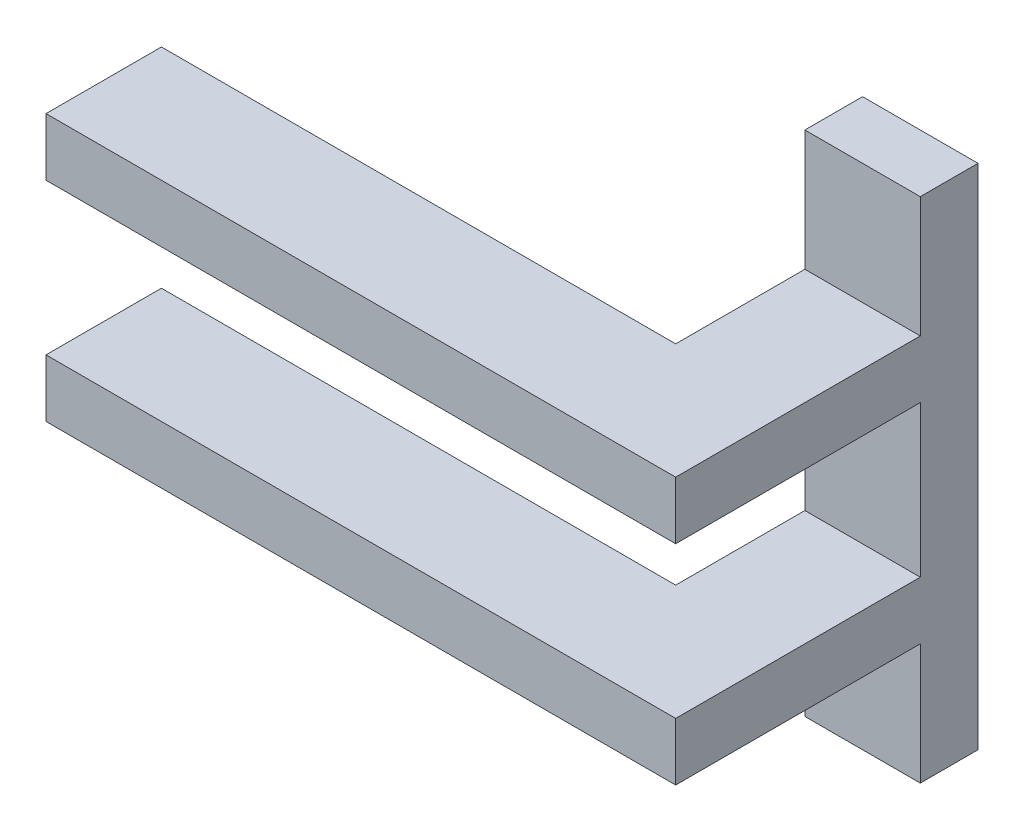
ISO-10303-21;
HEADER;
FILE_DESCRIPTION(('STEP AP214'),'2;1');
FILE_NAME('part.step','',(''),(''),'','','');
FILE_SCHEMA(('AUTOMOTIVE_DESIGN { 1 0 10303 214 1 1 1 1 }'));
ENDSEC;
DATA;
#1=APPLICATION_CONTEXT('core data for automotive mechanical design processes');
#2=APPLICATION_PROTOCOL_DEFINITION('international standard','automotive_design',2000,#1);
#3=PRODUCT_CONTEXT('',#1,'mechanical');
#4=PRODUCT('Part','Part','',(#3));
#5=PRODUCT_RELATED_PRODUCT_CATEGORY('part','',(#4));
#6=PRODUCT_DEFINITION_FORMATION('','',#4);
#7=PRODUCT_DEFINITION_CONTEXT('part definition',#1,'design');
#8=PRODUCT_DEFINITION('design','',#6,#7);
#9=PRODUCT_DEFINITION_SHAPE('','',#8);
#10=(LENGTH_UNIT() NAMED_UNIT(*) SI_UNIT(.MILLI.,.METRE.));
#11=(NAMED_UNIT(*) PLANE_ANGLE_UNIT() SI_UNIT($,.RADIAN.));
#12=(NAMED_UNIT(*) SI_UNIT($,.STERADIAN.) SOLID_ANGLE_UNIT());
#13=UNCERTAINTY_MEASURE_WITH_UNIT(LENGTH_MEASURE(1.E-05),#10,'distance_accuracy_value','');
#14=(GEOMETRIC_REPRESENTATION_CONTEXT(3) GLOBAL_UNCERTAINTY_ASSIGNED_CONTEXT((#13)) GLOBAL_UNIT_ASSIGNED_CONTEXT((#10,
#11,#12)) REPRESENTATION_CONTEXT('',''));
#15=CARTESIAN_POINT('',(0.,0.,0.));
#16=DIRECTION('',(0.,0.,1.));
#17=DIRECTION('',(1.,0.,0.));
#18=AXIS2_PLACEMENT_3D('',#15,#16,#17);
#19=CARTESIAN_POINT('',(0.,0.,50.));
#20=DIRECTION('',(0.,0.,1.));
#21=DIRECTION('',(1.,0.,0.));
#22=AXIS2_PLACEMENT_3D('',#19,#20,#21);
#23=PLANE('',#22);
#24=DIRECTION('',(1.,0.,0.));
#25=VECTOR('',#24,1.);
#26=CARTESIAN_POINT('',(25.,115.5,50.));
#27=LINE('',#26,#25);
#28=CARTESIAN_POINT('',(-50.,115.5,50.));
#29=VERTEX_POINT('',#28);
#30=CARTESIAN_POINT('',(50.,115.5,50.));
#31=VERTEX_POINT('',#30);
#32=EDGE_CURVE('E247',#29,#31,#27,.T.);
#33=ORIENTED_EDGE('',*,*,#32,.T.);
#34=DIRECTION('',(0.,1.,0.));
#35=VECTOR('',#34,1.);
#36=CARTESIAN_POINT('',(50.,220.,50.));
#37=LINE('',#36,#35);
#38=CARTESIAN_POINT('',(50.,220.,50.));
#39=VERTEX_POINT('',#38);
#40=EDGE_CURVE('E137',#31,#39,#37,.T.);
#41=ORIENTED_EDGE('',*,*,#40,.T.);
#42=DIRECTION('',(-1.,0.,0.));
#43=VECTOR('',#42,1.);
#44=CARTESIAN_POINT('',(-50.,220.,50.));
#45=LINE('',#44,#43);
#46=CARTESIAN_POINT('',(-50.,220.,50.));
#47=VERTEX_POINT('',#46);
#48=EDGE_CURVE('E11',#39,#47,#45,.T.);
#49=ORIENTED_EDGE('',*,*,#48,.T.);
#50=DIRECTION('',(0.,-1.,0.));
#51=VECTOR('',#50,1.);
#52=CARTESIAN_POINT('',(-50.,-220.,50.));
#53=LINE('',#52,#51);
#54=EDGE_CURVE('E199',#47,#29,#53,.T.);
#55=ORIENTED_EDGE('',*,*,#54,.T.);
#56=EDGE_LOOP('',(#33,#41,#49,#55));
#57=FACE_BOUND('',#56,.T.);
#58=ADVANCED_FACE('F17',(#57),#23,.T.);
#59=CARTESIAN_POINT('',(0.,0.,0.));
#60=DIRECTION('',(0.,0.,1.));
#61=DIRECTION('',(1.,0.,0.));
#62=AXIS2_PLACEMENT_3D('',#59,#60,#61);
#63=PLANE('',#62);
#64=CARTESIAN_POINT('',(0.,-100.,0.));
#65=DIRECTION('',(0.,0.,1.));
#66=DIRECTION('',(1.,0.,0.));
#67=AXIS2_PLACEMENT_3D('',#64,#65,#66);
#68=CIRCLE('',#67,6.5);
#69=CARTESIAN_POINT('',(-6.5,-100.,0.));
#70=VERTEX_POINT('',#69);
#71=EDGE_CURVE('E223',#70,#70,#68,.T.);
#72=ORIENTED_EDGE('',*,*,#71,.T.);
#73=EDGE_LOOP('',(#72));
#74=FACE_BOUND('',#73,.T.);
#75=CARTESIAN_POINT('',(0.,100.,0.));
#76=DIRECTION('',(0.,0.,1.));
#77=DIRECTION('',(1.,0.,0.));
#78=AXIS2_PLACEMENT_3D('',#75,#76,#77);
#79=CIRCLE('',#78,6.5);
#80=CARTESIAN_POINT('',(-6.5,100.,0.));
#81=VERTEX_POINT('',#80);
#82=EDGE_CURVE('E81',#81,#81,#79,.T.);
#83=ORIENTED_EDGE('',*,*,#82,.T.);
#84=EDGE_LOOP('',(#83));
#85=FACE_BOUND('',#84,.T.);
#86=DIRECTION('',(1.,0.,0.));
#87=VECTOR('',#86,1.);
#88=CARTESIAN_POINT('',(-50.,220.,0.));
#89=LINE('',#88,#87);
#90=CARTESIAN_POINT('',(-50.,220.,0.));
#91=VERTEX_POINT('',#90);
#92=CARTESIAN_POINT('',(50.,220.,0.));
#93=VERTEX_POINT('',#92);
#94=EDGE_CURVE('E28',#91,#93,#89,.T.);
#95=ORIENTED_EDGE('',*,*,#94,.T.);
#96=DIRECTION('',(0.,-1.,0.));
#97=VECTOR('',#96,1.);
#98=CARTESIAN_POINT('',(50.,220.,0.));
#99=LINE('',#98,#97);
#100=CARTESIAN_POINT('',(50.,-220.,0.));
#101=VERTEX_POINT('',#100);
#102=EDGE_CURVE('E204',#93,#101,#99,.T.);
#103=ORIENTED_EDGE('',*,*,#102,.T.);
#104=DIRECTION('',(-1.,0.,0.));
#105=VECTOR('',#104,1.);
#106=CARTESIAN_POINT('',(50.,-220.,0.));
#107=LINE('',#106,#105);
#108=CARTESIAN_POINT('',(-50.,-220.,0.));
#109=VERTEX_POINT('',#108);
#110=EDGE_CURVE('E194',#101,#109,#107,.T.);
#111=ORIENTED_EDGE('',*,*,#110,.T.);
#112=DIRECTION('',(0.,1.,0.));
#113=VECTOR('',#112,1.);
#114=CARTESIAN_POINT('',(-50.,-220.,0.));
#115=LINE('',#114,#113);
#116=EDGE_CURVE('E182',#109,#91,#115,.T.);
#117=ORIENTED_EDGE('',*,*,#116,.T.);
#118=EDGE_LOOP('',(#95,#103,#111,#117));
#119=FACE_BOUND('',#118,.T.);
#120=ADVANCED_FACE('F202',(#74,#85,#119),#63,.F.);
#121=CARTESIAN_POINT('',(50.,220.,0.));
#122=DIRECTION('',(0.,1.,0.));
#123=DIRECTION('',(1.,0.,0.));
#124=AXIS2_PLACEMENT_3D('',#121,#122,#123);
#125=PLANE('',#124);
#126=ORIENTED_EDGE('',*,*,#94,.F.);
#127=DIRECTION('',(0.,0.,1.));
#128=VECTOR('',#127,1.);
#129=CARTESIAN_POINT('',(-50.,220.,0.));
#130=LINE('',#129,#128);
#131=EDGE_CURVE('E188',#91,#47,#130,.T.);
#132=ORIENTED_EDGE('',*,*,#131,.T.);
#133=ORIENTED_EDGE('',*,*,#48,.F.);
#134=DIRECTION('',(0.,0.,1.));
#135=VECTOR('',#134,1.);
#136=CARTESIAN_POINT('',(50.,220.,0.));
#137=LINE('',#136,#135);
#138=EDGE_CURVE('E222',#93,#39,#137,.T.);
#139=ORIENTED_EDGE('',*,*,#138,.F.);
#140=EDGE_LOOP('',(#126,#132,#133,#139));
#141=FACE_BOUND('',#140,.T.);
#142=ADVANCED_FACE('F318',(#141),#125,.T.);
#143=CARTESIAN_POINT('',(-50.,220.,0.));
#144=DIRECTION('',(-1.,0.,0.));
#145=DIRECTION('',(0.,0.,1.));
#146=AXIS2_PLACEMENT_3D('',#143,#144,#145);
#147=PLANE('',#146);
#148=DIRECTION('',(0.,1.,0.));
#149=VECTOR('',#148,1.);
#150=CARTESIAN_POINT('',(-50.,167.75,161.9));
#151=LINE('',#150,#149);
#152=CARTESIAN_POINT('',(-50.,65.5,161.9));
#153=VERTEX_POINT('',#152);
#154=CARTESIAN_POINT('',(-50.,115.5,161.9));
#155=VERTEX_POINT('',#154);
#156=EDGE_CURVE('E246',#153,#155,#151,.T.);
#157=ORIENTED_EDGE('',*,*,#156,.T.);
#158=DIRECTION('',(0.,0.,1.));
#159=VECTOR('',#158,1.);
#160=CARTESIAN_POINT('',(-50.,115.5,50.));
#161=LINE('',#160,#159);
#162=EDGE_CURVE('E251',#29,#155,#161,.T.);
#163=ORIENTED_EDGE('',*,*,#162,.F.);
#164=ORIENTED_EDGE('',*,*,#54,.F.);
#165=ORIENTED_EDGE('',*,*,#131,.F.);
#166=ORIENTED_EDGE('',*,*,#116,.F.);
#167=DIRECTION('',(0.,0.,1.));
#168=VECTOR('',#167,1.);
#169=CARTESIAN_POINT('',(-50.,-220.,0.));
#170=LINE('',#169,#168);
#171=CARTESIAN_POINT('',(-50.,-220.,50.));
#172=VERTEX_POINT('',#171);
#173=EDGE_CURVE('E186',#109,#172,#170,.T.);
#174=ORIENTED_EDGE('',*,*,#173,.T.);
#175=DIRECTION('',(0.,-1.,0.));
#176=VECTOR('',#175,1.);
#177=CARTESIAN_POINT('',(-50.,-220.,50.));
#178=LINE('',#177,#176);
#179=CARTESIAN_POINT('',(-50.,-115.5,50.));
#180=VERTEX_POINT('',#179);
#181=EDGE_CURVE('E214',#180,#172,#178,.T.);
#182=ORIENTED_EDGE('',*,*,#181,.F.);
#183=DIRECTION('',(0.,0.,1.));
#184=VECTOR('',#183,1.);
#185=CARTESIAN_POINT('',(-50.,-115.5,50.));
#186=LINE('',#185,#184);
#187=CARTESIAN_POINT('',(-50.,-115.5,161.9));
#188=VERTEX_POINT('',#187);
#189=EDGE_CURVE('E351',#180,#188,#186,.T.);
#190=ORIENTED_EDGE('',*,*,#189,.T.);
#191=DIRECTION('',(0.,1.,0.));
#192=VECTOR('',#191,1.);
#193=CARTESIAN_POINT('',(-50.,77.25,161.9));
#194=LINE('',#193,#192);
#195=CARTESIAN_POINT('',(-50.,-65.5,161.9));
#196=VERTEX_POINT('',#195);
#197=EDGE_CURVE('E264',#188,#196,#194,.T.);
#198=ORIENTED_EDGE('',*,*,#197,.T.);
#199=DIRECTION('',(0.,0.,1.));
#200=VECTOR('',#199,1.);
#201=CARTESIAN_POINT('',(-50.,-65.5,50.));
#202=LINE('',#201,#200);
#203=CARTESIAN_POINT('',(-50.,-65.5,50.));
#204=VERTEX_POINT('',#203);
#205=EDGE_CURVE('E258',#204,#196,#202,.T.);
#206=ORIENTED_EDGE('',*,*,#205,.F.);
#207=DIRECTION('',(0.,-1.,0.));
#208=VECTOR('',#207,1.);
#209=CARTESIAN_POINT('',(-50.,-220.,50.));
#210=LINE('',#209,#208);
#211=CARTESIAN_POINT('',(-50.,65.5,50.));
#212=VERTEX_POINT('',#211);
#213=EDGE_CURVE('E279',#212,#204,#210,.T.);
#214=ORIENTED_EDGE('',*,*,#213,.F.);
#215=DIRECTION('',(0.,0.,1.));
#216=VECTOR('',#215,1.);
#217=CARTESIAN_POINT('',(-50.,65.5,50.));
#218=LINE('',#217,#216);
#219=EDGE_CURVE('E219',#212,#153,#218,.T.);
#220=ORIENTED_EDGE('',*,*,#219,.T.);
#221=EDGE_LOOP('',(#157,#163,#164,#165,#166,#174,#182,#190,#198,#206,#214,#220));
#222=FACE_BOUND('',#221,.T.);
#223=ADVANCED_FACE('F185',(#222),#147,.T.);
#224=CARTESIAN_POINT('',(-50.,-220.,0.));
#225=DIRECTION('',(0.,-1.,0.));
#226=DIRECTION('',(0.,0.,-1.));
#227=AXIS2_PLACEMENT_3D('',#224,#225,#226);
#228=PLANE('',#227);
#229=ORIENTED_EDGE('',*,*,#110,.F.);
#230=DIRECTION('',(0.,0.,1.));
#231=VECTOR('',#230,1.);
#232=CARTESIAN_POINT('',(50.,-220.,0.));
#233=LINE('',#232,#231);
#234=CARTESIAN_POINT('',(50.,-220.,50.));
#235=VERTEX_POINT('',#234);
#236=EDGE_CURVE('E95',#101,#235,#233,.T.);
#237=ORIENTED_EDGE('',*,*,#236,.T.);
#238=DIRECTION('',(1.,0.,0.));
#239=VECTOR('',#238,1.);
#240=CARTESIAN_POINT('',(50.,-220.,50.));
#241=LINE('',#240,#239);
#242=EDGE_CURVE('E196',#172,#235,#241,.T.);
#243=ORIENTED_EDGE('',*,*,#242,.F.);
#244=ORIENTED_EDGE('',*,*,#173,.F.);
#245=EDGE_LOOP('',(#229,#237,#243,#244));
#246=FACE_BOUND('',#245,.T.);
#247=ADVANCED_FACE('F193',(#246),#228,.T.);
#248=CARTESIAN_POINT('',(50.,-220.,0.));
#249=DIRECTION('',(1.,0.,0.));
#250=DIRECTION('',(0.,1.,0.));
#251=AXIS2_PLACEMENT_3D('',#248,#249,#250);
#252=PLANE('',#251);
#253=ORIENTED_EDGE('',*,*,#102,.F.);
#254=ORIENTED_EDGE('',*,*,#138,.T.);
#255=ORIENTED_EDGE('',*,*,#40,.F.);
#256=DIRECTION('',(0.,0.,1.));
#257=VECTOR('',#256,1.);
#258=CARTESIAN_POINT('',(50.,115.5,50.));
#259=LINE('',#258,#257);
#260=CARTESIAN_POINT('',(50.,115.5,261.9));
#261=VERTEX_POINT('',#260);
#262=EDGE_CURVE('E308',#31,#261,#259,.T.);
#263=ORIENTED_EDGE('',*,*,#262,.T.);
#264=DIRECTION('',(0.,1.,0.));
#265=VECTOR('',#264,1.);
#266=CARTESIAN_POINT('',(50.,-220.,261.9));
#267=LINE('',#266,#265);
#268=CARTESIAN_POINT('',(50.,65.5,261.9));
#269=VERTEX_POINT('',#268);
#270=EDGE_CURVE('E124',#269,#261,#267,.T.);
#271=ORIENTED_EDGE('',*,*,#270,.F.);
#272=DIRECTION('',(0.,0.,1.));
#273=VECTOR('',#272,1.);
#274=CARTESIAN_POINT('',(50.,65.5,50.));
#275=LINE('',#274,#273);
#276=CARTESIAN_POINT('',(50.,65.5,50.));
#277=VERTEX_POINT('',#276);
#278=EDGE_CURVE('E284',#277,#269,#275,.T.);
#279=ORIENTED_EDGE('',*,*,#278,.F.);
#280=DIRECTION('',(0.,1.,0.));
#281=VECTOR('',#280,1.);
#282=CARTESIAN_POINT('',(50.,220.,50.));
#283=LINE('',#282,#281);
#284=CARTESIAN_POINT('',(50.,-65.5,50.));
#285=VERTEX_POINT('',#284);
#286=EDGE_CURVE('E301',#285,#277,#283,.T.);
#287=ORIENTED_EDGE('',*,*,#286,.F.);
#288=DIRECTION('',(0.,0.,1.));
#289=VECTOR('',#288,1.);
#290=CARTESIAN_POINT('',(50.,-65.5,50.));
#291=LINE('',#290,#289);
#292=CARTESIAN_POINT('',(50.,-65.5,261.9));
#293=VERTEX_POINT('',#292);
#294=EDGE_CURVE('E257',#285,#293,#291,.T.);
#295=ORIENTED_EDGE('',*,*,#294,.T.);
#296=DIRECTION('',(0.,1.,0.));
#297=VECTOR('',#296,1.);
#298=CARTESIAN_POINT('',(50.,-220.,261.9));
#299=LINE('',#298,#297);
#300=CARTESIAN_POINT('',(50.,-115.5,261.9));
#301=VERTEX_POINT('',#300);
#302=EDGE_CURVE('E21',#301,#293,#299,.T.);
#303=ORIENTED_EDGE('',*,*,#302,.F.);
#304=DIRECTION('',(0.,0.,1.));
#305=VECTOR('',#304,1.);
#306=CARTESIAN_POINT('',(50.,-115.5,50.));
#307=LINE('',#306,#305);
#308=CARTESIAN_POINT('',(50.,-115.5,50.));
#309=VERTEX_POINT('',#308);
#310=EDGE_CURVE('E325',#309,#301,#307,.T.);
#311=ORIENTED_EDGE('',*,*,#310,.F.);
#312=DIRECTION('',(0.,1.,0.));
#313=VECTOR('',#312,1.);
#314=CARTESIAN_POINT('',(50.,220.,50.));
#315=LINE('',#314,#313);
#316=EDGE_CURVE('E275',#235,#309,#315,.T.);
#317=ORIENTED_EDGE('',*,*,#316,.F.);
#318=ORIENTED_EDGE('',*,*,#236,.F.);
#319=EDGE_LOOP('',(#253,#254,#255,#263,#271,#279,#287,#295,#303,#311,#317,#318));
#320=FACE_BOUND('',#319,.T.);
#321=ADVANCED_FACE('F322',(#320),#252,.T.);
#322=CARTESIAN_POINT('',(0.,-100.,-403.982378512647));
#323=DIRECTION('',(0.,0.,1.));
#324=DIRECTION('',(1.,0.,0.));
#325=AXIS2_PLACEMENT_3D('',#322,#323,#324);
#326=CYLINDRICAL_SURFACE('',#325,6.5);
#327=CARTESIAN_POINT('',(0.,-100.,50.));
#328=DIRECTION('',(0.,0.,-1.));
#329=DIRECTION('',(1.,0.,0.));
#330=AXIS2_PLACEMENT_3D('',#327,#328,#329);
#331=CIRCLE('',#330,6.5);
#332=CARTESIAN_POINT('',(-6.5,-100.,50.));
#333=VERTEX_POINT('',#332);
#334=EDGE_CURVE('E218',#333,#333,#331,.T.);
#335=ORIENTED_EDGE('',*,*,#334,.F.);
#336=DIRECTION('',(0.,0.,-1.));
#337=VECTOR('',#336,1.);
#338=CARTESIAN_POINT('',(-6.5,-100.,-403.982378512647));
#339=LINE('',#338,#337);
#340=EDGE_CURVE('E294',#333,#70,#339,.T.);
#341=ORIENTED_EDGE('',*,*,#340,.T.);
#342=ORIENTED_EDGE('',*,*,#71,.F.);
#343=ORIENTED_EDGE('',*,*,#340,.F.);
#344=EDGE_LOOP('',(#335,#341,#342,#343));
#345=FACE_BOUND('',#344,.T.);
#346=ADVANCED_FACE('F495',(#345),#326,.F.);
#347=CARTESIAN_POINT('',(0.,100.,-403.982378512647));
#348=DIRECTION('',(0.,0.,1.));
#349=DIRECTION('',(1.,0.,0.));
#350=AXIS2_PLACEMENT_3D('',#347,#348,#349);
#351=CYLINDRICAL_SURFACE('',#350,6.5);
#352=CARTESIAN_POINT('',(0.,100.,50.));
#353=DIRECTION('',(0.,0.,-1.));
#354=DIRECTION('',(1.,0.,0.));
#355=AXIS2_PLACEMENT_3D('',#352,#353,#354);
#356=CIRCLE('',#355,6.5);
#357=CARTESIAN_POINT('',(-6.5,100.,50.));
#358=VERTEX_POINT('',#357);
#359=EDGE_CURVE('E252',#358,#358,#356,.T.);
#360=ORIENTED_EDGE('',*,*,#359,.F.);
#361=DIRECTION('',(0.,0.,-1.));
#362=VECTOR('',#361,1.);
#363=CARTESIAN_POINT('',(-6.5,100.,-403.982378512647));
#364=LINE('',#363,#362);
#365=EDGE_CURVE('E295',#358,#81,#364,.T.);
#366=ORIENTED_EDGE('',*,*,#365,.T.);
#367=ORIENTED_EDGE('',*,*,#82,.F.);
#368=ORIENTED_EDGE('',*,*,#365,.F.);
#369=EDGE_LOOP('',(#360,#366,#367,#368));
#370=FACE_BOUND('',#369,.T.);
#371=ADVANCED_FACE('F487',(#370),#351,.F.);
#372=CARTESIAN_POINT('',(0.,0.,50.));
#373=DIRECTION('',(0.,0.,1.));
#374=DIRECTION('',(1.,0.,0.));
#375=AXIS2_PLACEMENT_3D('',#372,#373,#374);
#376=PLANE('',#375);
#377=DIRECTION('',(-1.,0.,0.));
#378=VECTOR('',#377,1.);
#379=CARTESIAN_POINT('',(-25.,65.5,50.));
#380=LINE('',#379,#378);
#381=EDGE_CURVE('E288',#277,#212,#380,.T.);
#382=ORIENTED_EDGE('',*,*,#381,.T.);
#383=ORIENTED_EDGE('',*,*,#213,.T.);
#384=DIRECTION('',(1.,0.,0.));
#385=VECTOR('',#384,1.);
#386=CARTESIAN_POINT('',(25.,-65.5,50.));
#387=LINE('',#386,#385);
#388=EDGE_CURVE('E269',#204,#285,#387,.T.);
#389=ORIENTED_EDGE('',*,*,#388,.T.);
#390=ORIENTED_EDGE('',*,*,#286,.T.);
#391=EDGE_LOOP('',(#382,#383,#389,#390));
#392=FACE_BOUND('',#391,.T.);
#393=ADVANCED_FACE('F485',(#392),#376,.T.);
#394=CARTESIAN_POINT('',(0.,0.,50.));
#395=DIRECTION('',(0.,0.,1.));
#396=DIRECTION('',(1.,0.,0.));
#397=AXIS2_PLACEMENT_3D('',#394,#395,#396);
#398=PLANE('',#397);
#399=DIRECTION('',(-1.,0.,0.));
#400=VECTOR('',#399,1.);
#401=CARTESIAN_POINT('',(-25.,-115.5,50.));
#402=LINE('',#401,#400);
#403=EDGE_CURVE('E268',#309,#180,#402,.T.);
#404=ORIENTED_EDGE('',*,*,#403,.T.);
#405=ORIENTED_EDGE('',*,*,#181,.T.);
#406=ORIENTED_EDGE('',*,*,#242,.T.);
#407=ORIENTED_EDGE('',*,*,#316,.T.);
#408=EDGE_LOOP('',(#404,#405,#406,#407));
#409=FACE_BOUND('',#408,.T.);
#410=ADVANCED_FACE('F19',(#409),#398,.T.);
#411=CARTESIAN_POINT('',(0.,-90.5,261.9));
#412=DIRECTION('',(0.,0.,1.));
#413=DIRECTION('',(1.,0.,0.));
#414=AXIS2_PLACEMENT_3D('',#411,#412,#413);
#415=PLANE('',#414);
#416=DIRECTION('',(-1.,0.,0.));
#417=VECTOR('',#416,1.);
#418=CARTESIAN_POINT('',(-50.,-115.5,261.9));
#419=LINE('',#418,#417);
#420=CARTESIAN_POINT('',(-495.5,-115.5,261.9));
#421=VERTEX_POINT('',#420);
#422=EDGE_CURVE('E355',#301,#421,#419,.T.);
#423=ORIENTED_EDGE('',*,*,#422,.F.);
#424=ORIENTED_EDGE('',*,*,#302,.T.);
#425=DIRECTION('',(-1.,0.,0.));
#426=VECTOR('',#425,1.);
#427=CARTESIAN_POINT('',(50.,-65.5,261.9));
#428=LINE('',#427,#426);
#429=CARTESIAN_POINT('',(-495.5,-65.5,261.9));
#430=VERTEX_POINT('',#429);
#431=EDGE_CURVE('E253',#293,#430,#428,.T.);
#432=ORIENTED_EDGE('',*,*,#431,.T.);
#433=DIRECTION('',(0.,1.,0.));
#434=VECTOR('',#433,1.);
#435=CARTESIAN_POINT('',(-495.5,-115.5,261.9));
#436=LINE('',#435,#434);
#437=EDGE_CURVE('E224',#421,#430,#436,.T.);
#438=ORIENTED_EDGE('',*,*,#437,.F.);
#439=EDGE_LOOP('',(#423,#424,#432,#438));
#440=FACE_BOUND('',#439,.T.);
#441=ADVANCED_FACE('F494',(#440),#415,.T.);
#442=CARTESIAN_POINT('',(-50.,-115.5,50.));
#443=DIRECTION('',(0.,-1.,0.));
#444=DIRECTION('',(-1.,0.,0.));
#445=AXIS2_PLACEMENT_3D('',#442,#443,#444);
#446=PLANE('',#445);
#447=ORIENTED_EDGE('',*,*,#403,.F.);
#448=ORIENTED_EDGE('',*,*,#310,.T.);
#449=ORIENTED_EDGE('',*,*,#422,.T.);
#450=DIRECTION('',(0.,0.,1.));
#451=VECTOR('',#450,1.);
#452=CARTESIAN_POINT('',(-495.5,-115.5,50.));
#453=LINE('',#452,#451);
#454=CARTESIAN_POINT('',(-495.5,-115.5,161.9));
#455=VERTEX_POINT('',#454);
#456=EDGE_CURVE('E283',#455,#421,#453,.T.);
#457=ORIENTED_EDGE('',*,*,#456,.F.);
#458=DIRECTION('',(-1.,0.,0.));
#459=VECTOR('',#458,1.);
#460=CARTESIAN_POINT('',(-50.,-115.5,161.9));
#461=LINE('',#460,#459);
#462=EDGE_CURVE('E259',#188,#455,#461,.T.);
#463=ORIENTED_EDGE('',*,*,#462,.F.);
#464=ORIENTED_EDGE('',*,*,#189,.F.);
#465=EDGE_LOOP('',(#447,#448,#449,#457,#463,#464));
#466=FACE_BOUND('',#465,.T.);
#467=ADVANCED_FACE('F524',(#466),#446,.T.);
#468=CARTESIAN_POINT('',(50.,-65.5,50.));
#469=DIRECTION('',(0.,1.,0.));
#470=DIRECTION('',(1.,0.,0.));
#471=AXIS2_PLACEMENT_3D('',#468,#469,#470);
#472=PLANE('',#471);
#473=ORIENTED_EDGE('',*,*,#388,.F.);
#474=ORIENTED_EDGE('',*,*,#205,.T.);
#475=DIRECTION('',(-1.,0.,0.));
#476=VECTOR('',#475,1.);
#477=CARTESIAN_POINT('',(-50.,-65.5,161.9));
#478=LINE('',#477,#476);
#479=CARTESIAN_POINT('',(-495.5,-65.5,161.9));
#480=VERTEX_POINT('',#479);
#481=EDGE_CURVE('E229',#196,#480,#478,.T.);
#482=ORIENTED_EDGE('',*,*,#481,.T.);
#483=DIRECTION('',(0.,0.,-1.));
#484=VECTOR('',#483,1.);
#485=CARTESIAN_POINT('',(-495.5,-65.5,261.9));
#486=LINE('',#485,#484);
#487=EDGE_CURVE('E228',#430,#480,#486,.T.);
#488=ORIENTED_EDGE('',*,*,#487,.F.);
#489=ORIENTED_EDGE('',*,*,#431,.F.);
#490=ORIENTED_EDGE('',*,*,#294,.F.);
#491=EDGE_LOOP('',(#473,#474,#482,#488,#489,#490));
#492=FACE_BOUND('',#491,.T.);
#493=ADVANCED_FACE('F397',(#492),#472,.T.);
#494=CARTESIAN_POINT('',(0.,-90.5,50.));
#495=DIRECTION('',(0.,0.,1.));
#496=DIRECTION('',(1.,0.,0.));
#497=AXIS2_PLACEMENT_3D('',#494,#495,#496);
#498=PLANE('',#497);
#499=ORIENTED_EDGE('',*,*,#334,.T.);
#500=EDGE_LOOP('',(#499));
#501=FACE_BOUND('',#500,.T.);
#502=ADVANCED_FACE('F510',(#501),#498,.F.);
#503=CARTESIAN_POINT('',(0.,90.5,261.9));
#504=DIRECTION('',(0.,0.,1.));
#505=DIRECTION('',(1.,0.,0.));
#506=AXIS2_PLACEMENT_3D('',#503,#504,#505);
#507=PLANE('',#506);
#508=DIRECTION('',(-1.,0.,0.));
#509=VECTOR('',#508,1.);
#510=CARTESIAN_POINT('',(-50.,65.5,261.9));
#511=LINE('',#510,#509);
#512=CARTESIAN_POINT('',(-495.5,65.5,261.9));
#513=VERTEX_POINT('',#512);
#514=EDGE_CURVE('E238',#269,#513,#511,.T.);
#515=ORIENTED_EDGE('',*,*,#514,.F.);
#516=ORIENTED_EDGE('',*,*,#270,.T.);
#517=DIRECTION('',(-1.,0.,0.));
#518=VECTOR('',#517,1.);
#519=CARTESIAN_POINT('',(50.,115.5,261.9));
#520=LINE('',#519,#518);
#521=CARTESIAN_POINT('',(-495.5,115.5,261.9));
#522=VERTEX_POINT('',#521);
#523=EDGE_CURVE('E305',#261,#522,#520,.T.);
#524=ORIENTED_EDGE('',*,*,#523,.T.);
#525=DIRECTION('',(0.,1.,0.));
#526=VECTOR('',#525,1.);
#527=CARTESIAN_POINT('',(-495.5,65.5,261.9));
#528=LINE('',#527,#526);
#529=EDGE_CURVE('E234',#513,#522,#528,.T.);
#530=ORIENTED_EDGE('',*,*,#529,.F.);
#531=EDGE_LOOP('',(#515,#516,#524,#530));
#532=FACE_BOUND('',#531,.T.);
#533=ADVANCED_FACE('F426',(#532),#507,.T.);
#534=CARTESIAN_POINT('',(-50.,65.5,50.));
#535=DIRECTION('',(0.,-1.,0.));
#536=DIRECTION('',(-1.,0.,0.));
#537=AXIS2_PLACEMENT_3D('',#534,#535,#536);
#538=PLANE('',#537);
#539=ORIENTED_EDGE('',*,*,#381,.F.);
#540=ORIENTED_EDGE('',*,*,#278,.T.);
#541=ORIENTED_EDGE('',*,*,#514,.T.);
#542=DIRECTION('',(0.,0.,1.));
#543=VECTOR('',#542,1.);
#544=CARTESIAN_POINT('',(-495.5,65.5,50.));
#545=LINE('',#544,#543);
#546=CARTESIAN_POINT('',(-495.5,65.5,161.9));
#547=VERTEX_POINT('',#546);
#548=EDGE_CURVE('E230',#547,#513,#545,.T.);
#549=ORIENTED_EDGE('',*,*,#548,.F.);
#550=DIRECTION('',(-1.,0.,0.));
#551=VECTOR('',#550,1.);
#552=CARTESIAN_POINT('',(-50.,65.5,161.9));
#553=LINE('',#552,#551);
#554=EDGE_CURVE('E241',#153,#547,#553,.T.);
#555=ORIENTED_EDGE('',*,*,#554,.F.);
#556=ORIENTED_EDGE('',*,*,#219,.F.);
#557=EDGE_LOOP('',(#539,#540,#541,#549,#555,#556));
#558=FACE_BOUND('',#557,.T.);
#559=ADVANCED_FACE('F436',(#558),#538,.T.);
#560=CARTESIAN_POINT('',(50.,115.5,50.));
#561=DIRECTION('',(0.,1.,0.));
#562=DIRECTION('',(1.,0.,0.));
#563=AXIS2_PLACEMENT_3D('',#560,#561,#562);
#564=PLANE('',#563);
#565=ORIENTED_EDGE('',*,*,#32,.F.);
#566=ORIENTED_EDGE('',*,*,#162,.T.);
#567=DIRECTION('',(-1.,0.,0.));
#568=VECTOR('',#567,1.);
#569=CARTESIAN_POINT('',(-50.,115.5,161.9));
#570=LINE('',#569,#568);
#571=CARTESIAN_POINT('',(-495.5,115.5,161.9));
#572=VERTEX_POINT('',#571);
#573=EDGE_CURVE('E235',#155,#572,#570,.T.);
#574=ORIENTED_EDGE('',*,*,#573,.T.);
#575=DIRECTION('',(0.,0.,-1.));
#576=VECTOR('',#575,1.);
#577=CARTESIAN_POINT('',(-495.5,115.5,261.9));
#578=LINE('',#577,#576);
#579=EDGE_CURVE('E375',#522,#572,#578,.T.);
#580=ORIENTED_EDGE('',*,*,#579,.F.);
#581=ORIENTED_EDGE('',*,*,#523,.F.);
#582=ORIENTED_EDGE('',*,*,#262,.F.);
#583=EDGE_LOOP('',(#565,#566,#574,#580,#581,#582));
#584=FACE_BOUND('',#583,.T.);
#585=ADVANCED_FACE('F428',(#584),#564,.T.);
#586=CARTESIAN_POINT('',(0.,90.5,50.));
#587=DIRECTION('',(0.,0.,1.));
#588=DIRECTION('',(1.,0.,0.));
#589=AXIS2_PLACEMENT_3D('',#586,#587,#588);
#590=PLANE('',#589);
#591=ORIENTED_EDGE('',*,*,#359,.T.);
#592=EDGE_LOOP('',(#591));
#593=FACE_BOUND('',#592,.T.);
#594=ADVANCED_FACE('F520',(#593),#590,.F.);
#595=CARTESIAN_POINT('',(-495.5,-90.5,211.9));
#596=DIRECTION('',(-1.,0.,0.));
#597=DIRECTION('',(0.,0.,1.));
#598=AXIS2_PLACEMENT_3D('',#595,#596,#597);
#599=PLANE('',#598);
#600=ORIENTED_EDGE('',*,*,#437,.T.);
#601=ORIENTED_EDGE('',*,*,#487,.T.);
#602=DIRECTION('',(0.,-1.,0.));
#603=VECTOR('',#602,1.);
#604=CARTESIAN_POINT('',(-495.5,-65.5,161.9));
#605=LINE('',#604,#603);
#606=EDGE_CURVE('E263',#480,#455,#605,.T.);
#607=ORIENTED_EDGE('',*,*,#606,.T.);
#608=ORIENTED_EDGE('',*,*,#456,.T.);
#609=EDGE_LOOP('',(#600,#601,#607,#608));
#610=FACE_BOUND('',#609,.T.);
#611=ADVANCED_FACE('F407',(#610),#599,.T.);
#612=CARTESIAN_POINT('',(-50.,-65.5,161.9));
#613=DIRECTION('',(0.,0.,-1.));
#614=DIRECTION('',(0.,-1.,0.));
#615=AXIS2_PLACEMENT_3D('',#612,#613,#614);
#616=PLANE('',#615);
#617=ORIENTED_EDGE('',*,*,#197,.F.);
#618=ORIENTED_EDGE('',*,*,#462,.T.);
#619=ORIENTED_EDGE('',*,*,#606,.F.);
#620=ORIENTED_EDGE('',*,*,#481,.F.);
#621=EDGE_LOOP('',(#617,#618,#619,#620));
#622=FACE_BOUND('',#621,.T.);
#623=ADVANCED_FACE('F402',(#622),#616,.T.);
#624=CARTESIAN_POINT('',(-495.5,90.5,211.9));
#625=DIRECTION('',(-1.,0.,0.));
#626=DIRECTION('',(0.,0.,1.));
#627=AXIS2_PLACEMENT_3D('',#624,#625,#626);
#628=PLANE('',#627);
#629=ORIENTED_EDGE('',*,*,#548,.T.);
#630=ORIENTED_EDGE('',*,*,#529,.T.);
#631=ORIENTED_EDGE('',*,*,#579,.T.);
#632=DIRECTION('',(0.,-1.,0.));
#633=VECTOR('',#632,1.);
#634=CARTESIAN_POINT('',(-495.5,115.5,161.9));
#635=LINE('',#634,#633);
#636=EDGE_CURVE('E245',#572,#547,#635,.T.);
#637=ORIENTED_EDGE('',*,*,#636,.T.);
#638=EDGE_LOOP('',(#629,#630,#631,#637));
#639=FACE_BOUND('',#638,.T.);
#640=ADVANCED_FACE('F431',(#639),#628,.T.);
#641=CARTESIAN_POINT('',(-50.,115.5,161.9));
#642=DIRECTION('',(0.,0.,-1.));
#643=DIRECTION('',(0.,-1.,0.));
#644=AXIS2_PLACEMENT_3D('',#641,#642,#643);
#645=PLANE('',#644);
#646=ORIENTED_EDGE('',*,*,#156,.F.);
#647=ORIENTED_EDGE('',*,*,#554,.T.);
#648=ORIENTED_EDGE('',*,*,#636,.F.);
#649=ORIENTED_EDGE('',*,*,#573,.F.);
#650=EDGE_LOOP('',(#646,#647,#648,#649));
#651=FACE_BOUND('',#650,.T.);
#652=ADVANCED_FACE('F483',(#651),#645,.T.);
#653=CLOSED_SHELL('',(#58,#120,#142,#223,#247,#321,#346,#371,#393,#410,#441,#467,#493,#502,#533,
#559,#585,#594,#611,#623,#640,#652));
#654=MANIFOLD_SOLID_BREP('B1',#653);
#655=ADVANCED_BREP_SHAPE_REPRESENTATION('',(#18,#654),#14);
#656=SHAPE_DEFINITION_REPRESENTATION(#9,#655);
ENDSEC;
END-ISO-10303-21;
